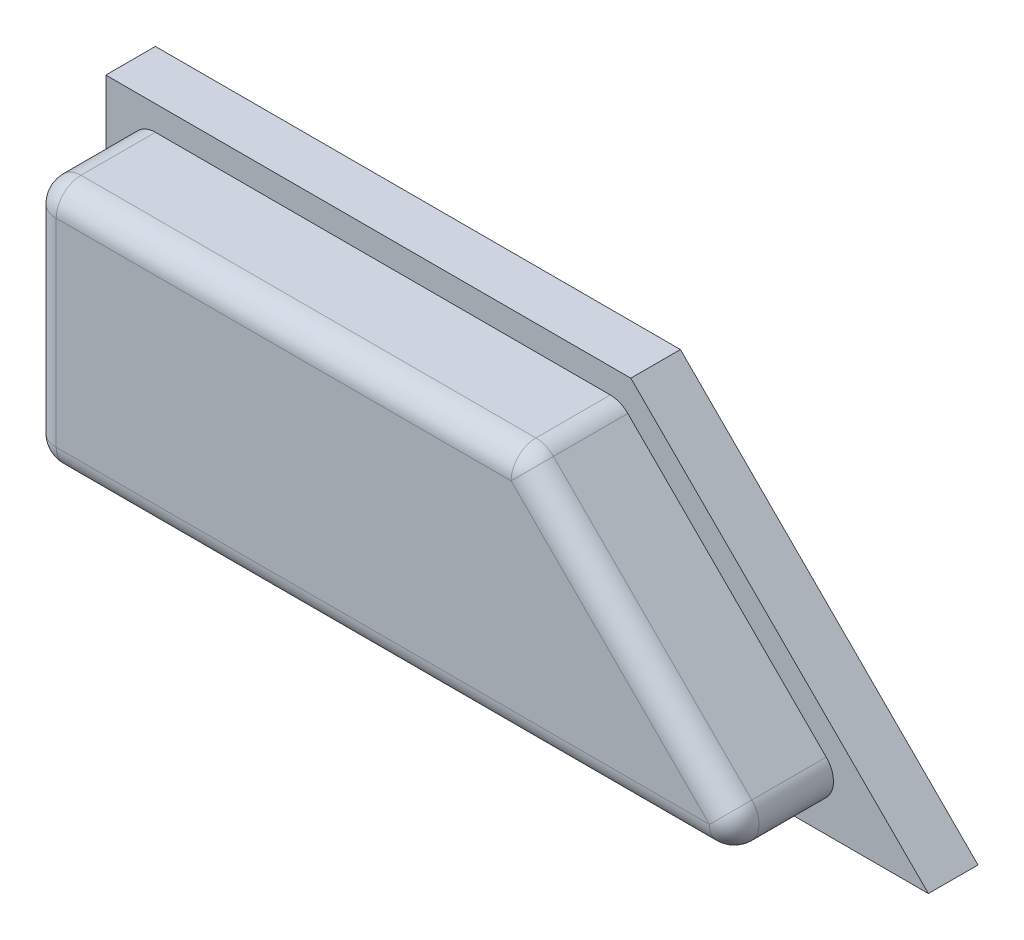
ISO-10303-21;
HEADER;
FILE_DESCRIPTION(('STEP AP214'),'2;1');
FILE_NAME('part.step','',(''),(''),'','','');
FILE_SCHEMA(('AUTOMOTIVE_DESIGN { 1 0 10303 214 1 1 1 1 }'));
ENDSEC;
DATA;
#1=APPLICATION_CONTEXT('core data for automotive mechanical design processes');
#2=APPLICATION_PROTOCOL_DEFINITION('international standard','automotive_design',2000,#1);
#3=PRODUCT_CONTEXT('',#1,'mechanical');
#4=PRODUCT('Part','Part','',(#3));
#5=PRODUCT_RELATED_PRODUCT_CATEGORY('part','',(#4));
#6=PRODUCT_DEFINITION_FORMATION('','',#4);
#7=PRODUCT_DEFINITION_CONTEXT('part definition',#1,'design');
#8=PRODUCT_DEFINITION('design','',#6,#7);
#9=PRODUCT_DEFINITION_SHAPE('','',#8);
#10=(LENGTH_UNIT() NAMED_UNIT(*) SI_UNIT(.MILLI.,.METRE.));
#11=(NAMED_UNIT(*) PLANE_ANGLE_UNIT() SI_UNIT($,.RADIAN.));
#12=(NAMED_UNIT(*) SI_UNIT($,.STERADIAN.) SOLID_ANGLE_UNIT());
#13=UNCERTAINTY_MEASURE_WITH_UNIT(LENGTH_MEASURE(1.E-05),#10,'distance_accuracy_value','');
#14=(GEOMETRIC_REPRESENTATION_CONTEXT(3) GLOBAL_UNCERTAINTY_ASSIGNED_CONTEXT((#13)) GLOBAL_UNIT_ASSIGNED_CONTEXT((#10,
#11,#12)) REPRESENTATION_CONTEXT('',''));
#15=CARTESIAN_POINT('',(0.,0.,0.));
#16=DIRECTION('',(0.,0.,1.));
#17=DIRECTION('',(1.,0.,0.));
#18=AXIS2_PLACEMENT_3D('',#15,#16,#17);
#19=CARTESIAN_POINT('',(0.,0.,1.));
#20=DIRECTION('',(0.,0.,1.));
#21=DIRECTION('',(1.,0.,0.));
#22=AXIS2_PLACEMENT_3D('',#19,#20,#21);
#23=PLANE('',#22);
#24=DIRECTION('',(1.,0.,0.));
#25=VECTOR('',#24,1.);
#26=CARTESIAN_POINT('',(5.58578643762691,0.999999999999999,1.));
#27=LINE('',#26,#25);
#28=CARTESIAN_POINT('',(-11.,0.999999999999999,1.));
#29=VERTEX_POINT('',#28);
#30=CARTESIAN_POINT('',(5.58578643762691,0.999999999999999,1.));
#31=VERTEX_POINT('',#30);
#32=EDGE_CURVE('E144',#29,#31,#27,.T.);
#33=ORIENTED_EDGE('',*,*,#32,.T.);
#34=DIRECTION('',(-0.707106781186548,0.707106781186547,0.));
#35=VECTOR('',#34,1.);
#36=CARTESIAN_POINT('',(-0.414213562373095,7.,1.));
#37=LINE('',#36,#35);
#38=CARTESIAN_POINT('',(-0.414213562373095,7.,1.));
#39=VERTEX_POINT('',#38);
#40=EDGE_CURVE('E134',#31,#39,#37,.T.);
#41=ORIENTED_EDGE('',*,*,#40,.T.);
#42=DIRECTION('',(-1.,0.,0.));
#43=VECTOR('',#42,1.);
#44=CARTESIAN_POINT('',(-11.,7.,1.));
#45=LINE('',#44,#43);
#46=CARTESIAN_POINT('',(-11.,7.,1.));
#47=VERTEX_POINT('',#46);
#48=EDGE_CURVE('E143',#39,#47,#45,.T.);
#49=ORIENTED_EDGE('',*,*,#48,.T.);
#50=DIRECTION('',(0.,-1.,0.));
#51=VECTOR('',#50,1.);
#52=CARTESIAN_POINT('',(-11.,7.,1.));
#53=LINE('',#52,#51);
#54=EDGE_CURVE('E149',#47,#29,#53,.T.);
#55=ORIENTED_EDGE('',*,*,#54,.T.);
#56=EDGE_LOOP('',(#33,#41,#49,#55));
#57=FACE_BOUND('',#56,.T.);
#58=DIRECTION('',(1.,0.,0.));
#59=VECTOR('',#58,1.);
#60=CARTESIAN_POINT('',(4.37867965644036,1.5,1.));
#61=LINE('',#60,#59);
#62=CARTESIAN_POINT('',(-10.,1.5,1.));
#63=VERTEX_POINT('',#62);
#64=CARTESIAN_POINT('',(3.17157287525381,1.5,1.));
#65=VERTEX_POINT('',#64);
#66=EDGE_CURVE('E236',#63,#65,#61,.T.);
#67=ORIENTED_EDGE('',*,*,#66,.F.);
#68=CARTESIAN_POINT('',(-10.,2.,1.));
#69=DIRECTION('',(0.,0.,1.));
#70=DIRECTION('',(1.,0.,0.));
#71=AXIS2_PLACEMENT_3D('',#68,#69,#70);
#72=CIRCLE('',#71,0.5);
#73=CARTESIAN_POINT('',(-10.5,2.,1.));
#74=VERTEX_POINT('',#73);
#75=EDGE_CURVE('E197',#63,#74,#72,.F.);
#76=ORIENTED_EDGE('',*,*,#75,.T.);
#77=DIRECTION('',(0.,-1.,0.));
#78=VECTOR('',#77,1.);
#79=CARTESIAN_POINT('',(-10.5,6.5,1.));
#80=LINE('',#79,#78);
#81=CARTESIAN_POINT('',(-10.5,6.,1.));
#82=VERTEX_POINT('',#81);
#83=EDGE_CURVE('E233',#82,#74,#80,.T.);
#84=ORIENTED_EDGE('',*,*,#83,.F.);
#85=CARTESIAN_POINT('',(-10.,6.,1.));
#86=DIRECTION('',(0.,0.,1.));
#87=DIRECTION('',(1.,0.,0.));
#88=AXIS2_PLACEMENT_3D('',#85,#86,#87);
#89=CIRCLE('',#88,0.5);
#90=CARTESIAN_POINT('',(-10.,6.5,1.));
#91=VERTEX_POINT('',#90);
#92=EDGE_CURVE('E42',#82,#91,#89,.F.);
#93=ORIENTED_EDGE('',*,*,#92,.T.);
#94=DIRECTION('',(-1.,0.,0.));
#95=VECTOR('',#94,1.);
#96=CARTESIAN_POINT('',(-10.5,6.5,1.));
#97=LINE('',#96,#95);
#98=CARTESIAN_POINT('',(-0.828427124746189,6.5,1.));
#99=VERTEX_POINT('',#98);
#100=EDGE_CURVE('E246',#99,#91,#97,.T.);
#101=ORIENTED_EDGE('',*,*,#100,.F.);
#102=CARTESIAN_POINT('',(-0.828427124746189,6.,1.));
#103=DIRECTION('',(0.,0.,1.));
#104=DIRECTION('',(1.,0.,0.));
#105=AXIS2_PLACEMENT_3D('',#102,#103,#104);
#106=CIRCLE('',#105,0.5);
#107=CARTESIAN_POINT('',(-0.474873734152915,6.35355339059327,1.));
#108=VERTEX_POINT('',#107);
#109=EDGE_CURVE('E11',#99,#108,#106,.F.);
#110=ORIENTED_EDGE('',*,*,#109,.T.);
#111=DIRECTION('',(-0.707106781186548,0.707106781186548,0.));
#112=VECTOR('',#111,1.);
#113=CARTESIAN_POINT('',(-0.621320343559641,6.5,1.));
#114=LINE('',#113,#112);
#115=CARTESIAN_POINT('',(3.52512626584709,2.35355339059327,1.));
#116=VERTEX_POINT('',#115);
#117=EDGE_CURVE('E241',#116,#108,#114,.T.);
#118=ORIENTED_EDGE('',*,*,#117,.F.);
#119=CARTESIAN_POINT('',(3.17157287525381,2.,1.));
#120=DIRECTION('',(0.,0.,1.));
#121=DIRECTION('',(1.,0.,0.));
#122=AXIS2_PLACEMENT_3D('',#119,#120,#121);
#123=CIRCLE('',#122,0.5);
#124=EDGE_CURVE('E195',#116,#65,#123,.F.);
#125=ORIENTED_EDGE('',*,*,#124,.T.);
#126=EDGE_LOOP('',(#67,#76,#84,#93,#101,#110,#118,#125));
#127=FACE_BOUND('',#126,.T.);
#128=ADVANCED_FACE('F33',(#57,#127),#23,.T.);
#129=CARTESIAN_POINT('',(-0.414213562373095,7.,1.));
#130=DIRECTION('',(-0.707106781186547,-0.707106781186548,0.));
#131=DIRECTION('',(0.707106781186548,-0.707106781186547,0.));
#132=AXIS2_PLACEMENT_3D('',#129,#130,#131);
#133=PLANE('',#132);
#134=DIRECTION('',(-0.707106781186548,0.707106781186547,0.));
#135=VECTOR('',#134,1.);
#136=CARTESIAN_POINT('',(-0.414213562373095,7.,0.));
#137=LINE('',#136,#135);
#138=CARTESIAN_POINT('',(5.58578643762691,0.999999999999999,0.));
#139=VERTEX_POINT('',#138);
#140=CARTESIAN_POINT('',(-0.414213562373095,7.,0.));
#141=VERTEX_POINT('',#140);
#142=EDGE_CURVE('E248',#139,#141,#137,.T.);
#143=ORIENTED_EDGE('',*,*,#142,.T.);
#144=DIRECTION('',(0.,0.,-1.));
#145=VECTOR('',#144,1.);
#146=CARTESIAN_POINT('',(-0.414213562373095,7.,1.));
#147=LINE('',#146,#145);
#148=EDGE_CURVE('E140',#39,#141,#147,.T.);
#149=ORIENTED_EDGE('',*,*,#148,.F.);
#150=ORIENTED_EDGE('',*,*,#40,.F.);
#151=DIRECTION('',(0.,0.,-1.));
#152=VECTOR('',#151,1.);
#153=CARTESIAN_POINT('',(5.58578643762691,0.999999999999999,1.));
#154=LINE('',#153,#152);
#155=EDGE_CURVE('E138',#31,#139,#154,.T.);
#156=ORIENTED_EDGE('',*,*,#155,.T.);
#157=EDGE_LOOP('',(#143,#149,#150,#156));
#158=FACE_BOUND('',#157,.T.);
#159=ADVANCED_FACE('F136',(#158),#133,.F.);
#160=CARTESIAN_POINT('',(-11.,7.,1.));
#161=DIRECTION('',(0.,-1.,0.));
#162=DIRECTION('',(0.,0.,-1.));
#163=AXIS2_PLACEMENT_3D('',#160,#161,#162);
#164=PLANE('',#163);
#165=DIRECTION('',(-1.,0.,0.));
#166=VECTOR('',#165,1.);
#167=CARTESIAN_POINT('',(-11.,7.,0.));
#168=LINE('',#167,#166);
#169=CARTESIAN_POINT('',(-11.,7.,0.));
#170=VERTEX_POINT('',#169);
#171=EDGE_CURVE('E254',#141,#170,#168,.T.);
#172=ORIENTED_EDGE('',*,*,#171,.T.);
#173=DIRECTION('',(0.,0.,-1.));
#174=VECTOR('',#173,1.);
#175=CARTESIAN_POINT('',(-11.,7.,1.));
#176=LINE('',#175,#174);
#177=EDGE_CURVE('E162',#47,#170,#176,.T.);
#178=ORIENTED_EDGE('',*,*,#177,.F.);
#179=ORIENTED_EDGE('',*,*,#48,.F.);
#180=ORIENTED_EDGE('',*,*,#148,.T.);
#181=EDGE_LOOP('',(#172,#178,#179,#180));
#182=FACE_BOUND('',#181,.T.);
#183=ADVANCED_FACE('F268',(#182),#164,.F.);
#184=CARTESIAN_POINT('',(-11.,7.,1.));
#185=DIRECTION('',(1.,0.,0.));
#186=DIRECTION('',(0.,0.,-1.));
#187=AXIS2_PLACEMENT_3D('',#184,#185,#186);
#188=PLANE('',#187);
#189=DIRECTION('',(0.,-1.,0.));
#190=VECTOR('',#189,1.);
#191=CARTESIAN_POINT('',(-11.,7.,0.));
#192=LINE('',#191,#190);
#193=CARTESIAN_POINT('',(-11.,0.999999999999999,0.));
#194=VERTEX_POINT('',#193);
#195=EDGE_CURVE('E256',#170,#194,#192,.T.);
#196=ORIENTED_EDGE('',*,*,#195,.T.);
#197=DIRECTION('',(0.,0.,-1.));
#198=VECTOR('',#197,1.);
#199=CARTESIAN_POINT('',(-11.,0.999999999999999,1.));
#200=LINE('',#199,#198);
#201=EDGE_CURVE('E252',#29,#194,#200,.T.);
#202=ORIENTED_EDGE('',*,*,#201,.F.);
#203=ORIENTED_EDGE('',*,*,#54,.F.);
#204=ORIENTED_EDGE('',*,*,#177,.T.);
#205=EDGE_LOOP('',(#196,#202,#203,#204));
#206=FACE_BOUND('',#205,.T.);
#207=ADVANCED_FACE('F263',(#206),#188,.F.);
#208=CARTESIAN_POINT('',(-11.,0.999999999999999,1.));
#209=DIRECTION('',(0.,1.,0.));
#210=DIRECTION('',(-1.,0.,0.));
#211=AXIS2_PLACEMENT_3D('',#208,#209,#210);
#212=PLANE('',#211);
#213=DIRECTION('',(1.,0.,0.));
#214=VECTOR('',#213,1.);
#215=CARTESIAN_POINT('',(-11.,0.999999999999999,0.));
#216=LINE('',#215,#214);
#217=EDGE_CURVE('E153',#194,#139,#216,.T.);
#218=ORIENTED_EDGE('',*,*,#217,.T.);
#219=ORIENTED_EDGE('',*,*,#155,.F.);
#220=ORIENTED_EDGE('',*,*,#32,.F.);
#221=ORIENTED_EDGE('',*,*,#201,.T.);
#222=EDGE_LOOP('',(#218,#219,#220,#221));
#223=FACE_BOUND('',#222,.T.);
#224=ADVANCED_FACE('F155',(#223),#212,.F.);
#225=CARTESIAN_POINT('',(0.,0.,0.));
#226=DIRECTION('',(0.,0.,1.));
#227=DIRECTION('',(1.,0.,0.));
#228=AXIS2_PLACEMENT_3D('',#225,#226,#227);
#229=PLANE('',#228);
#230=ORIENTED_EDGE('',*,*,#142,.F.);
#231=ORIENTED_EDGE('',*,*,#217,.F.);
#232=ORIENTED_EDGE('',*,*,#195,.F.);
#233=ORIENTED_EDGE('',*,*,#171,.F.);
#234=EDGE_LOOP('',(#230,#231,#232,#233));
#235=FACE_BOUND('',#234,.T.);
#236=ADVANCED_FACE('F267',(#235),#229,.F.);
#237=CARTESIAN_POINT('',(-10.5,6.5,3.));
#238=DIRECTION('',(1.,0.,0.));
#239=DIRECTION('',(0.,0.,-1.));
#240=AXIS2_PLACEMENT_3D('',#237,#238,#239);
#241=PLANE('',#240);
#242=ORIENTED_EDGE('',*,*,#83,.T.);
#243=DIRECTION('',(0.,0.,-1.));
#244=VECTOR('',#243,1.);
#245=CARTESIAN_POINT('',(-10.5,2.,3.));
#246=LINE('',#245,#244);
#247=CARTESIAN_POINT('',(-10.5,2.,2.5));
#248=VERTEX_POINT('',#247);
#249=EDGE_CURVE('E189',#74,#248,#246,.F.);
#250=ORIENTED_EDGE('',*,*,#249,.T.);
#251=DIRECTION('',(0.,-1.,0.));
#252=VECTOR('',#251,1.);
#253=CARTESIAN_POINT('',(-10.5,6.5,2.5));
#254=LINE('',#253,#252);
#255=CARTESIAN_POINT('',(-10.5,6.,2.5));
#256=VERTEX_POINT('',#255);
#257=EDGE_CURVE('E187',#248,#256,#254,.F.);
#258=ORIENTED_EDGE('',*,*,#257,.T.);
#259=DIRECTION('',(0.,0.,-1.));
#260=VECTOR('',#259,1.);
#261=CARTESIAN_POINT('',(-10.5,6.,3.));
#262=LINE('',#261,#260);
#263=EDGE_CURVE('E185',#256,#82,#262,.T.);
#264=ORIENTED_EDGE('',*,*,#263,.T.);
#265=EDGE_LOOP('',(#242,#250,#258,#264));
#266=FACE_BOUND('',#265,.T.);
#267=ADVANCED_FACE('F283',(#266),#241,.F.);
#268=CARTESIAN_POINT('',(4.37867965644036,1.5,3.));
#269=DIRECTION('',(0.,1.,0.));
#270=DIRECTION('',(-1.,0.,0.));
#271=AXIS2_PLACEMENT_3D('',#268,#269,#270);
#272=PLANE('',#271);
#273=ORIENTED_EDGE('',*,*,#66,.T.);
#274=DIRECTION('',(0.,0.,-1.));
#275=VECTOR('',#274,1.);
#276=CARTESIAN_POINT('',(3.17157287525381,1.5,3.));
#277=LINE('',#276,#275);
#278=CARTESIAN_POINT('',(3.17157287525381,1.5,2.5));
#279=VERTEX_POINT('',#278);
#280=EDGE_CURVE('E50',#65,#279,#277,.F.);
#281=ORIENTED_EDGE('',*,*,#280,.T.);
#282=DIRECTION('',(1.,0.,0.));
#283=VECTOR('',#282,1.);
#284=CARTESIAN_POINT('',(-10.5,1.5,2.5));
#285=LINE('',#284,#283);
#286=CARTESIAN_POINT('',(-10.,1.5,2.5));
#287=VERTEX_POINT('',#286);
#288=EDGE_CURVE('E54',#279,#287,#285,.F.);
#289=ORIENTED_EDGE('',*,*,#288,.T.);
#290=DIRECTION('',(0.,0.,-1.));
#291=VECTOR('',#290,1.);
#292=CARTESIAN_POINT('',(-10.,1.5,3.));
#293=LINE('',#292,#291);
#294=EDGE_CURVE('E191',#287,#63,#293,.T.);
#295=ORIENTED_EDGE('',*,*,#294,.T.);
#296=EDGE_LOOP('',(#273,#281,#289,#295));
#297=FACE_BOUND('',#296,.T.);
#298=ADVANCED_FACE('F302',(#297),#272,.F.);
#299=CARTESIAN_POINT('',(-0.621320343559641,6.5,3.));
#300=DIRECTION('',(-0.707106781186547,-0.707106781186547,0.));
#301=DIRECTION('',(0.707106781186548,-0.707106781186548,0.));
#302=AXIS2_PLACEMENT_3D('',#299,#300,#301);
#303=PLANE('',#302);
#304=DIRECTION('',(-0.707106781186548,0.707106781186548,0.));
#305=VECTOR('',#304,1.);
#306=CARTESIAN_POINT('',(4.37867965644036,1.5,2.5));
#307=LINE('',#306,#305);
#308=CARTESIAN_POINT('',(-0.474873734152915,6.35355339059327,2.5));
#309=VERTEX_POINT('',#308);
#310=CARTESIAN_POINT('',(3.52512626584709,2.35355339059327,2.5));
#311=VERTEX_POINT('',#310);
#312=EDGE_CURVE('E174',#309,#311,#307,.F.);
#313=ORIENTED_EDGE('',*,*,#312,.T.);
#314=DIRECTION('',(0.,0.,-1.));
#315=VECTOR('',#314,1.);
#316=CARTESIAN_POINT('',(3.52512626584709,2.35355339059327,3.));
#317=LINE('',#316,#315);
#318=EDGE_CURVE('E177',#311,#116,#317,.T.);
#319=ORIENTED_EDGE('',*,*,#318,.T.);
#320=ORIENTED_EDGE('',*,*,#117,.T.);
#321=DIRECTION('',(0.,0.,-1.));
#322=VECTOR('',#321,1.);
#323=CARTESIAN_POINT('',(-0.474873734152915,6.35355339059327,3.));
#324=LINE('',#323,#322);
#325=EDGE_CURVE('E172',#108,#309,#324,.F.);
#326=ORIENTED_EDGE('',*,*,#325,.T.);
#327=EDGE_LOOP('',(#313,#319,#320,#326));
#328=FACE_BOUND('',#327,.T.);
#329=ADVANCED_FACE('F308',(#328),#303,.F.);
#330=CARTESIAN_POINT('',(-10.5,6.5,3.));
#331=DIRECTION('',(0.,-1.,0.));
#332=DIRECTION('',(0.,0.,-1.));
#333=AXIS2_PLACEMENT_3D('',#330,#331,#332);
#334=PLANE('',#333);
#335=ORIENTED_EDGE('',*,*,#100,.T.);
#336=DIRECTION('',(0.,0.,-1.));
#337=VECTOR('',#336,1.);
#338=CARTESIAN_POINT('',(-10.,6.5,3.));
#339=LINE('',#338,#337);
#340=CARTESIAN_POINT('',(-10.,6.5,2.5));
#341=VERTEX_POINT('',#340);
#342=EDGE_CURVE('E183',#91,#341,#339,.F.);
#343=ORIENTED_EDGE('',*,*,#342,.T.);
#344=DIRECTION('',(-1.,0.,0.));
#345=VECTOR('',#344,1.);
#346=CARTESIAN_POINT('',(-0.621320343559641,6.5,2.5));
#347=LINE('',#346,#345);
#348=CARTESIAN_POINT('',(-0.828427124746189,6.5,2.5));
#349=VERTEX_POINT('',#348);
#350=EDGE_CURVE('E181',#341,#349,#347,.F.);
#351=ORIENTED_EDGE('',*,*,#350,.T.);
#352=DIRECTION('',(0.,0.,-1.));
#353=VECTOR('',#352,1.);
#354=CARTESIAN_POINT('',(-0.828427124746189,6.5,3.));
#355=LINE('',#354,#353);
#356=EDGE_CURVE('E179',#349,#99,#355,.T.);
#357=ORIENTED_EDGE('',*,*,#356,.T.);
#358=EDGE_LOOP('',(#335,#343,#351,#357));
#359=FACE_BOUND('',#358,.T.);
#360=ADVANCED_FACE('F314',(#359),#334,.F.);
#361=CARTESIAN_POINT('',(0.,0.,3.));
#362=DIRECTION('',(0.,0.,1.));
#363=DIRECTION('',(1.,0.,0.));
#364=AXIS2_PLACEMENT_3D('',#361,#362,#363);
#365=PLANE('',#364);
#366=DIRECTION('',(1.,0.,0.));
#367=VECTOR('',#366,1.);
#368=CARTESIAN_POINT('',(4.37867965644036,2.,3.));
#369=LINE('',#368,#367);
#370=CARTESIAN_POINT('',(-10.,2.,3.));
#371=VERTEX_POINT('',#370);
#372=CARTESIAN_POINT('',(3.17157287525381,2.,3.));
#373=VERTEX_POINT('',#372);
#374=EDGE_CURVE('E158',#371,#373,#369,.T.);
#375=ORIENTED_EDGE('',*,*,#374,.T.);
#376=DIRECTION('',(-0.707106781186548,0.707106781186548,0.));
#377=VECTOR('',#376,1.);
#378=CARTESIAN_POINT('',(-0.974873734152916,6.14644660940673,3.));
#379=LINE('',#378,#377);
#380=CARTESIAN_POINT('',(-0.828427124746188,6.,3.));
#381=VERTEX_POINT('',#380);
#382=EDGE_CURVE('E169',#373,#381,#379,.T.);
#383=ORIENTED_EDGE('',*,*,#382,.T.);
#384=DIRECTION('',(-1.,0.,0.));
#385=VECTOR('',#384,1.);
#386=CARTESIAN_POINT('',(-10.5,6.,3.));
#387=LINE('',#386,#385);
#388=CARTESIAN_POINT('',(-10.,6.,3.));
#389=VERTEX_POINT('',#388);
#390=EDGE_CURVE('E167',#381,#389,#387,.T.);
#391=ORIENTED_EDGE('',*,*,#390,.T.);
#392=DIRECTION('',(0.,-1.,0.));
#393=VECTOR('',#392,1.);
#394=CARTESIAN_POINT('',(-10.,1.5,3.));
#395=LINE('',#394,#393);
#396=EDGE_CURVE('E160',#389,#371,#395,.T.);
#397=ORIENTED_EDGE('',*,*,#396,.T.);
#398=EDGE_LOOP('',(#375,#383,#391,#397));
#399=FACE_BOUND('',#398,.T.);
#400=ADVANCED_FACE('F322',(#399),#365,.T.);
#401=CARTESIAN_POINT('',(-10.,2.,3.));
#402=DIRECTION('',(0.,0.,-1.));
#403=DIRECTION('',(-1.,0.,0.));
#404=AXIS2_PLACEMENT_3D('',#401,#402,#403);
#405=CYLINDRICAL_SURFACE('',#404,0.5);
#406=ORIENTED_EDGE('',*,*,#75,.F.);
#407=ORIENTED_EDGE('',*,*,#294,.F.);
#408=CARTESIAN_POINT('',(-10.,2.,2.5));
#409=DIRECTION('',(0.,0.,1.));
#410=DIRECTION('',(1.,0.,0.));
#411=AXIS2_PLACEMENT_3D('',#408,#409,#410);
#412=CIRCLE('',#411,0.5);
#413=EDGE_CURVE('E37',#248,#287,#412,.T.);
#414=ORIENTED_EDGE('',*,*,#413,.F.);
#415=ORIENTED_EDGE('',*,*,#249,.F.);
#416=EDGE_LOOP('',(#406,#407,#414,#415));
#417=FACE_BOUND('',#416,.T.);
#418=ADVANCED_FACE('F35',(#417),#405,.T.);
#419=CARTESIAN_POINT('',(-10.,0.,2.5));
#420=DIRECTION('',(0.,1.,0.));
#421=DIRECTION('',(0.,0.,1.));
#422=AXIS2_PLACEMENT_3D('',#419,#420,#421);
#423=CYLINDRICAL_SURFACE('',#422,0.5);
#424=CARTESIAN_POINT('',(-10.,6.,2.5));
#425=DIRECTION('',(0.,1.,0.));
#426=DIRECTION('',(0.,0.,1.));
#427=AXIS2_PLACEMENT_3D('',#424,#425,#426);
#428=CIRCLE('',#427,0.5);
#429=EDGE_CURVE('E225',#256,#389,#428,.T.);
#430=ORIENTED_EDGE('',*,*,#429,.F.);
#431=ORIENTED_EDGE('',*,*,#257,.F.);
#432=CARTESIAN_POINT('',(-10.,2.,2.5));
#433=DIRECTION('',(0.,-1.,0.));
#434=DIRECTION('',(0.,0.,-1.));
#435=AXIS2_PLACEMENT_3D('',#432,#433,#434);
#436=CIRCLE('',#435,0.5);
#437=EDGE_CURVE('E227',#371,#248,#436,.T.);
#438=ORIENTED_EDGE('',*,*,#437,.F.);
#439=ORIENTED_EDGE('',*,*,#396,.F.);
#440=EDGE_LOOP('',(#430,#431,#438,#439));
#441=FACE_BOUND('',#440,.T.);
#442=ADVANCED_FACE('F337',(#441),#423,.T.);
#443=CARTESIAN_POINT('',(-10.,6.,3.));
#444=DIRECTION('',(0.,0.,-1.));
#445=DIRECTION('',(-1.,0.,0.));
#446=AXIS2_PLACEMENT_3D('',#443,#444,#445);
#447=CYLINDRICAL_SURFACE('',#446,0.5);
#448=ORIENTED_EDGE('',*,*,#92,.F.);
#449=ORIENTED_EDGE('',*,*,#263,.F.);
#450=CARTESIAN_POINT('',(-10.,6.,2.5));
#451=DIRECTION('',(0.,0.,1.));
#452=DIRECTION('',(1.,0.,0.));
#453=AXIS2_PLACEMENT_3D('',#450,#451,#452);
#454=CIRCLE('',#453,0.5);
#455=EDGE_CURVE('E222',#341,#256,#454,.T.);
#456=ORIENTED_EDGE('',*,*,#455,.F.);
#457=ORIENTED_EDGE('',*,*,#342,.F.);
#458=EDGE_LOOP('',(#448,#449,#456,#457));
#459=FACE_BOUND('',#458,.T.);
#460=ADVANCED_FACE('F344',(#459),#447,.T.);
#461=CARTESIAN_POINT('',(-10.,2.,2.5));
#462=DIRECTION('',(0.,0.,1.));
#463=DIRECTION('',(1.,0.,0.));
#464=AXIS2_PLACEMENT_3D('',#461,#462,#463);
#465=SPHERICAL_SURFACE('',#464,0.5);
#466=ORIENTED_EDGE('',*,*,#437,.T.);
#467=ORIENTED_EDGE('',*,*,#413,.T.);
#468=CARTESIAN_POINT('',(-10.,2.,2.5));
#469=DIRECTION('',(-1.,0.,0.));
#470=DIRECTION('',(0.,0.,1.));
#471=AXIS2_PLACEMENT_3D('',#468,#469,#470);
#472=CIRCLE('',#471,0.5);
#473=EDGE_CURVE('E219',#371,#287,#472,.F.);
#474=ORIENTED_EDGE('',*,*,#473,.F.);
#475=EDGE_LOOP('',(#466,#467,#474));
#476=FACE_BOUND('',#475,.T.);
#477=ADVANCED_FACE('F351',(#476),#465,.T.);
#478=CARTESIAN_POINT('',(-10.,6.,2.5));
#479=DIRECTION('',(0.,0.,1.));
#480=DIRECTION('',(1.,0.,0.));
#481=AXIS2_PLACEMENT_3D('',#478,#479,#480);
#482=SPHERICAL_SURFACE('',#481,0.5);
#483=ORIENTED_EDGE('',*,*,#455,.T.);
#484=ORIENTED_EDGE('',*,*,#429,.T.);
#485=CARTESIAN_POINT('',(-10.,6.,2.5));
#486=DIRECTION('',(-1.,0.,0.));
#487=DIRECTION('',(0.,0.,1.));
#488=AXIS2_PLACEMENT_3D('',#485,#486,#487);
#489=CIRCLE('',#488,0.5);
#490=EDGE_CURVE('E216',#341,#389,#489,.F.);
#491=ORIENTED_EDGE('',*,*,#490,.F.);
#492=EDGE_LOOP('',(#483,#484,#491));
#493=FACE_BOUND('',#492,.T.);
#494=ADVANCED_FACE('F359',(#493),#482,.T.);
#495=CARTESIAN_POINT('',(3.17157287525381,2.,3.));
#496=DIRECTION('',(0.,0.,-1.));
#497=DIRECTION('',(-1.,0.,0.));
#498=AXIS2_PLACEMENT_3D('',#495,#496,#497);
#499=CYLINDRICAL_SURFACE('',#498,0.5);
#500=ORIENTED_EDGE('',*,*,#124,.F.);
#501=ORIENTED_EDGE('',*,*,#318,.F.);
#502=CARTESIAN_POINT('',(3.17157287525381,2.,2.5));
#503=DIRECTION('',(0.,0.,1.));
#504=DIRECTION('',(1.,0.,0.));
#505=AXIS2_PLACEMENT_3D('',#502,#503,#504);
#506=CIRCLE('',#505,0.5);
#507=EDGE_CURVE('E213',#279,#311,#506,.T.);
#508=ORIENTED_EDGE('',*,*,#507,.F.);
#509=ORIENTED_EDGE('',*,*,#280,.F.);
#510=EDGE_LOOP('',(#500,#501,#508,#509));
#511=FACE_BOUND('',#510,.T.);
#512=ADVANCED_FACE('F366',(#511),#499,.T.);
#513=CARTESIAN_POINT('',(0.,2.,2.5));
#514=DIRECTION('',(-1.,0.,0.));
#515=DIRECTION('',(0.,-1.,0.));
#516=AXIS2_PLACEMENT_3D('',#513,#514,#515);
#517=CYLINDRICAL_SURFACE('',#516,0.5);
#518=ORIENTED_EDGE('',*,*,#473,.T.);
#519=ORIENTED_EDGE('',*,*,#288,.F.);
#520=CARTESIAN_POINT('',(3.17157287525381,2.,2.5));
#521=DIRECTION('',(1.,0.,0.));
#522=DIRECTION('',(0.,1.,0.));
#523=AXIS2_PLACEMENT_3D('',#520,#521,#522);
#524=CIRCLE('',#523,0.5);
#525=EDGE_CURVE('E210',#373,#279,#524,.T.);
#526=ORIENTED_EDGE('',*,*,#525,.F.);
#527=ORIENTED_EDGE('',*,*,#374,.F.);
#528=EDGE_LOOP('',(#518,#519,#526,#527));
#529=FACE_BOUND('',#528,.T.);
#530=ADVANCED_FACE('F374',(#529),#517,.T.);
#531=CARTESIAN_POINT('',(0.,6.,2.5));
#532=DIRECTION('',(1.,0.,0.));
#533=DIRECTION('',(0.,0.,-1.));
#534=AXIS2_PLACEMENT_3D('',#531,#532,#533);
#535=CYLINDRICAL_SURFACE('',#534,0.5);
#536=ORIENTED_EDGE('',*,*,#490,.T.);
#537=ORIENTED_EDGE('',*,*,#390,.F.);
#538=CARTESIAN_POINT('',(-0.828427124746189,6.,2.5));
#539=DIRECTION('',(1.,0.,0.));
#540=DIRECTION('',(0.,0.,-1.));
#541=AXIS2_PLACEMENT_3D('',#538,#539,#540);
#542=CIRCLE('',#541,0.5);
#543=EDGE_CURVE('E207',#349,#381,#542,.T.);
#544=ORIENTED_EDGE('',*,*,#543,.F.);
#545=ORIENTED_EDGE('',*,*,#350,.F.);
#546=EDGE_LOOP('',(#536,#537,#544,#545));
#547=FACE_BOUND('',#546,.T.);
#548=ADVANCED_FACE('F382',(#547),#535,.T.);
#549=CARTESIAN_POINT('',(-0.828427124746189,6.,3.));
#550=DIRECTION('',(0.,0.,-1.));
#551=DIRECTION('',(-1.,0.,0.));
#552=AXIS2_PLACEMENT_3D('',#549,#550,#551);
#553=CYLINDRICAL_SURFACE('',#552,0.5);
#554=ORIENTED_EDGE('',*,*,#109,.F.);
#555=ORIENTED_EDGE('',*,*,#356,.F.);
#556=CARTESIAN_POINT('',(-0.828427124746189,6.,2.5));
#557=DIRECTION('',(0.,0.,1.));
#558=DIRECTION('',(1.,0.,0.));
#559=AXIS2_PLACEMENT_3D('',#556,#557,#558);
#560=CIRCLE('',#559,0.5);
#561=EDGE_CURVE('E204',#309,#349,#560,.T.);
#562=ORIENTED_EDGE('',*,*,#561,.F.);
#563=ORIENTED_EDGE('',*,*,#325,.F.);
#564=EDGE_LOOP('',(#554,#555,#562,#563));
#565=FACE_BOUND('',#564,.T.);
#566=ADVANCED_FACE('F390',(#565),#553,.T.);
#567=CARTESIAN_POINT('',(3.17157287525381,2.,2.5));
#568=DIRECTION('',(0.,0.,1.));
#569=DIRECTION('',(1.,0.,0.));
#570=AXIS2_PLACEMENT_3D('',#567,#568,#569);
#571=SPHERICAL_SURFACE('',#570,0.5);
#572=ORIENTED_EDGE('',*,*,#525,.T.);
#573=ORIENTED_EDGE('',*,*,#507,.T.);
#574=CARTESIAN_POINT('',(3.17157287525381,2.,2.5));
#575=DIRECTION('',(0.707106781186548,-0.707106781186548,0.));
#576=DIRECTION('',(0.707106781186548,0.707106781186548,0.));
#577=AXIS2_PLACEMENT_3D('',#574,#575,#576);
#578=CIRCLE('',#577,0.5);
#579=EDGE_CURVE('E202',#373,#311,#578,.F.);
#580=ORIENTED_EDGE('',*,*,#579,.F.);
#581=EDGE_LOOP('',(#572,#573,#580));
#582=FACE_BOUND('',#581,.T.);
#583=ADVANCED_FACE('F398',(#582),#571,.T.);
#584=CARTESIAN_POINT('',(-0.828427124746188,6.,2.5));
#585=DIRECTION('',(0.,0.,1.));
#586=DIRECTION('',(1.,0.,0.));
#587=AXIS2_PLACEMENT_3D('',#584,#585,#586);
#588=SPHERICAL_SURFACE('',#587,0.5);
#589=ORIENTED_EDGE('',*,*,#561,.T.);
#590=ORIENTED_EDGE('',*,*,#543,.T.);
#591=CARTESIAN_POINT('',(-0.828427124746188,6.,2.5));
#592=DIRECTION('',(-0.707106781186547,0.707106781186548,0.));
#593=DIRECTION('',(-0.707106781186548,-0.707106781186547,0.));
#594=AXIS2_PLACEMENT_3D('',#591,#592,#593);
#595=CIRCLE('',#594,0.5);
#596=EDGE_CURVE('E200',#309,#381,#595,.F.);
#597=ORIENTED_EDGE('',*,*,#596,.F.);
#598=EDGE_LOOP('',(#589,#590,#597));
#599=FACE_BOUND('',#598,.T.);
#600=ADVANCED_FACE('F406',(#599),#588,.T.);
#601=CARTESIAN_POINT('',(2.5857864376269,2.5857864376269,2.5));
#602=DIRECTION('',(0.707106781186548,-0.707106781186548,0.));
#603=DIRECTION('',(0.707106781186548,0.707106781186548,0.));
#604=AXIS2_PLACEMENT_3D('',#601,#602,#603);
#605=CYLINDRICAL_SURFACE('',#604,0.5);
#606=ORIENTED_EDGE('',*,*,#579,.T.);
#607=ORIENTED_EDGE('',*,*,#312,.F.);
#608=ORIENTED_EDGE('',*,*,#596,.T.);
#609=ORIENTED_EDGE('',*,*,#382,.F.);
#610=EDGE_LOOP('',(#606,#607,#608,#609));
#611=FACE_BOUND('',#610,.T.);
#612=ADVANCED_FACE('F414',(#611),#605,.T.);
#613=CLOSED_SHELL('',(#128,#159,#183,#207,#224,#236,#267,#298,#329,#360,#400,#418,#442,#460,
#477,#494,#512,#530,#548,#566,#583,#600,#612));
#614=MANIFOLD_SOLID_BREP('B2',#613);
#615=ADVANCED_BREP_SHAPE_REPRESENTATION('',(#18,#614),#14);
#616=SHAPE_DEFINITION_REPRESENTATION(#9,#615);
ENDSEC;
END-ISO-10303-21;
